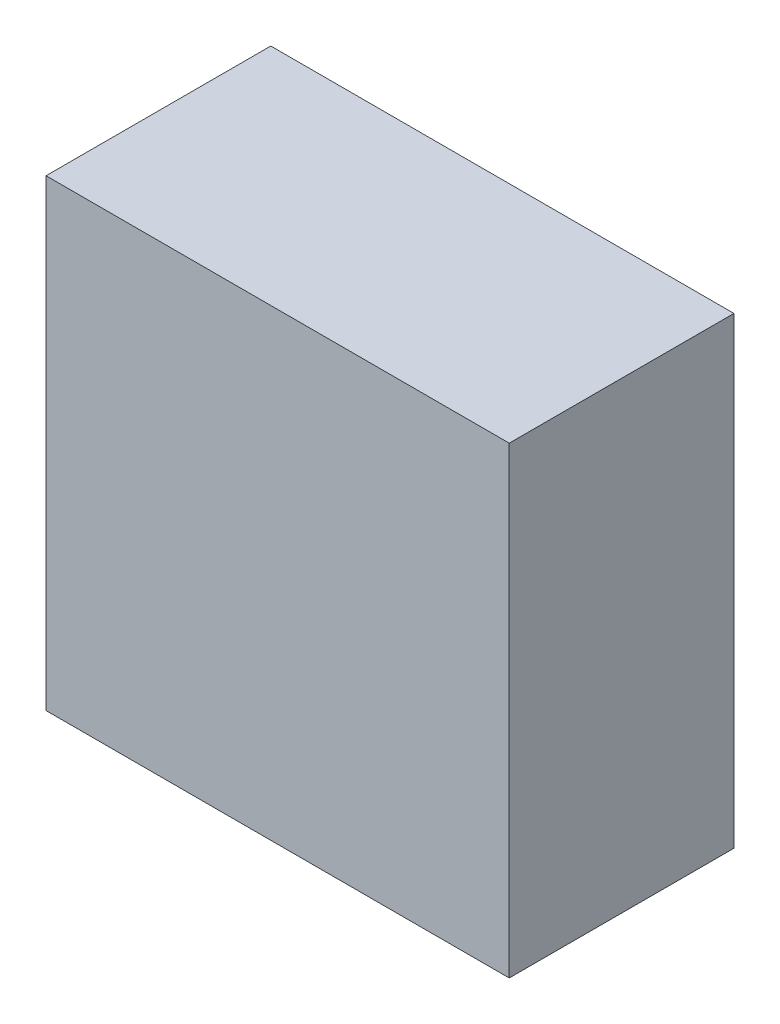
ISO-10303-21;
HEADER;
FILE_DESCRIPTION(('STEP AP214'),'2;1');
FILE_NAME('part.step','',(''),(''),'','','');
FILE_SCHEMA(('AUTOMOTIVE_DESIGN { 1 0 10303 214 1 1 1 1 }'));
ENDSEC;
DATA;
#1=APPLICATION_CONTEXT('core data for automotive mechanical design processes');
#2=APPLICATION_PROTOCOL_DEFINITION('international standard','automotive_design',2000,#1);
#3=PRODUCT_CONTEXT('',#1,'mechanical');
#4=PRODUCT('Part','Part','',(#3));
#5=PRODUCT_RELATED_PRODUCT_CATEGORY('part','',(#4));
#6=PRODUCT_DEFINITION_FORMATION('','',#4);
#7=PRODUCT_DEFINITION_CONTEXT('part definition',#1,'design');
#8=PRODUCT_DEFINITION('design','',#6,#7);
#9=PRODUCT_DEFINITION_SHAPE('','',#8);
#10=(LENGTH_UNIT() NAMED_UNIT(*) SI_UNIT(.MILLI.,.METRE.));
#11=(NAMED_UNIT(*) PLANE_ANGLE_UNIT() SI_UNIT($,.RADIAN.));
#12=(NAMED_UNIT(*) SI_UNIT($,.STERADIAN.) SOLID_ANGLE_UNIT());
#13=UNCERTAINTY_MEASURE_WITH_UNIT(LENGTH_MEASURE(1.E-05),#10,'distance_accuracy_value','');
#14=(GEOMETRIC_REPRESENTATION_CONTEXT(3) GLOBAL_UNCERTAINTY_ASSIGNED_CONTEXT((#13)) GLOBAL_UNIT_ASSIGNED_CONTEXT((#10,
#11,#12)) REPRESENTATION_CONTEXT('',''));
#15=CARTESIAN_POINT('',(0.,0.,0.));
#16=DIRECTION('',(0.,0.,1.));
#17=DIRECTION('',(1.,0.,0.));
#18=AXIS2_PLACEMENT_3D('',#15,#16,#17);
#19=CARTESIAN_POINT('',(0.0508,2.921,2.16));
#20=DIRECTION('',(0.,0.,-1.));
#21=DIRECTION('',(-1.,0.,0.));
#22=AXIS2_PLACEMENT_3D('',#19,#20,#21);
#23=PLANE('',#22);
#24=DIRECTION('',(1.,0.,0.));
#25=VECTOR('',#24,1.);
#26=CARTESIAN_POINT('',(-3.8862,-1.016,2.16));
#27=LINE('',#26,#25);
#28=CARTESIAN_POINT('',(-3.8862,-1.016,2.16));
#29=VERTEX_POINT('',#28);
#30=CARTESIAN_POINT('',(0.0508,-1.016,2.16));
#31=VERTEX_POINT('',#30);
#32=EDGE_CURVE('E67',#29,#31,#27,.T.);
#33=ORIENTED_EDGE('',*,*,#32,.T.);
#34=DIRECTION('',(0.,1.,0.));
#35=VECTOR('',#34,1.);
#36=CARTESIAN_POINT('',(0.0508,-1.016,2.16));
#37=LINE('',#36,#35);
#38=CARTESIAN_POINT('',(0.0508,2.921,2.16));
#39=VERTEX_POINT('',#38);
#40=EDGE_CURVE('E54',#31,#39,#37,.T.);
#41=ORIENTED_EDGE('',*,*,#40,.T.);
#42=DIRECTION('',(1.,0.,0.));
#43=VECTOR('',#42,1.);
#44=CARTESIAN_POINT('',(0.0508,2.921,2.16));
#45=LINE('',#44,#43);
#46=CARTESIAN_POINT('',(-3.8862,2.921,2.16));
#47=VERTEX_POINT('',#46);
#48=EDGE_CURVE('E19',#39,#47,#45,.F.);
#49=ORIENTED_EDGE('',*,*,#48,.T.);
#50=DIRECTION('',(0.,1.,0.));
#51=VECTOR('',#50,1.);
#52=CARTESIAN_POINT('',(-3.8862,2.921,2.16));
#53=LINE('',#52,#51);
#54=EDGE_CURVE('E80',#47,#29,#53,.F.);
#55=ORIENTED_EDGE('',*,*,#54,.T.);
#56=EDGE_LOOP('',(#33,#41,#49,#55));
#57=FACE_BOUND('',#56,.T.);
#58=ADVANCED_FACE('F16',(#57),#23,.F.);
#59=CARTESIAN_POINT('',(0.0508,2.921,0.25));
#60=DIRECTION('',(0.,-1.,0.));
#61=DIRECTION('',(0.,0.,-1.));
#62=AXIS2_PLACEMENT_3D('',#59,#60,#61);
#63=PLANE('',#62);
#64=DIRECTION('',(0.,0.,1.));
#65=VECTOR('',#64,1.);
#66=CARTESIAN_POINT('',(0.0508,2.921,0.25));
#67=LINE('',#66,#65);
#68=CARTESIAN_POINT('',(0.0508,2.921,0.25));
#69=VERTEX_POINT('',#68);
#70=EDGE_CURVE('E60',#39,#69,#67,.F.);
#71=ORIENTED_EDGE('',*,*,#70,.T.);
#72=DIRECTION('',(-1.,0.,0.));
#73=VECTOR('',#72,1.);
#74=CARTESIAN_POINT('',(0.0508,2.921,0.25));
#75=LINE('',#74,#73);
#76=CARTESIAN_POINT('',(-3.8862,2.921,0.25));
#77=VERTEX_POINT('',#76);
#78=EDGE_CURVE('E82',#77,#69,#75,.F.);
#79=ORIENTED_EDGE('',*,*,#78,.F.);
#80=DIRECTION('',(0.,0.,-1.));
#81=VECTOR('',#80,1.);
#82=CARTESIAN_POINT('',(-3.8862,2.921,0.25));
#83=LINE('',#82,#81);
#84=EDGE_CURVE('E63',#77,#47,#83,.F.);
#85=ORIENTED_EDGE('',*,*,#84,.T.);
#86=ORIENTED_EDGE('',*,*,#48,.F.);
#87=EDGE_LOOP('',(#71,#79,#85,#86));
#88=FACE_BOUND('',#87,.T.);
#89=ADVANCED_FACE('F59',(#88),#63,.F.);
#90=CARTESIAN_POINT('',(0.0508,-1.016,0.25));
#91=DIRECTION('',(-1.,0.,0.));
#92=DIRECTION('',(0.,0.,1.));
#93=AXIS2_PLACEMENT_3D('',#90,#91,#92);
#94=PLANE('',#93);
#95=DIRECTION('',(0.,0.,1.));
#96=VECTOR('',#95,1.);
#97=CARTESIAN_POINT('',(0.0508,-1.016,0.25));
#98=LINE('',#97,#96);
#99=CARTESIAN_POINT('',(0.0508,-1.016,0.25));
#100=VERTEX_POINT('',#99);
#101=EDGE_CURVE('E69',#31,#100,#98,.F.);
#102=ORIENTED_EDGE('',*,*,#101,.T.);
#103=DIRECTION('',(0.,1.,0.));
#104=VECTOR('',#103,1.);
#105=CARTESIAN_POINT('',(0.0508,2.921,0.25));
#106=LINE('',#105,#104);
#107=EDGE_CURVE('E73',#69,#100,#106,.F.);
#108=ORIENTED_EDGE('',*,*,#107,.F.);
#109=ORIENTED_EDGE('',*,*,#70,.F.);
#110=ORIENTED_EDGE('',*,*,#40,.F.);
#111=EDGE_LOOP('',(#102,#108,#109,#110));
#112=FACE_BOUND('',#111,.T.);
#113=ADVANCED_FACE('F71',(#112),#94,.F.);
#114=CARTESIAN_POINT('',(-3.8862,-1.016,0.25));
#115=DIRECTION('',(0.,1.,0.));
#116=DIRECTION('',(0.,0.,1.));
#117=AXIS2_PLACEMENT_3D('',#114,#115,#116);
#118=PLANE('',#117);
#119=DIRECTION('',(0.,0.,-1.));
#120=VECTOR('',#119,1.);
#121=CARTESIAN_POINT('',(-3.8862,-1.016,0.25));
#122=LINE('',#121,#120);
#123=CARTESIAN_POINT('',(-3.8862,-1.016,0.25));
#124=VERTEX_POINT('',#123);
#125=EDGE_CURVE('E34',#29,#124,#122,.T.);
#126=ORIENTED_EDGE('',*,*,#125,.T.);
#127=DIRECTION('',(-1.,0.,0.));
#128=VECTOR('',#127,1.);
#129=CARTESIAN_POINT('',(0.0508,-1.016,0.25));
#130=LINE('',#129,#128);
#131=EDGE_CURVE('E25',#100,#124,#130,.T.);
#132=ORIENTED_EDGE('',*,*,#131,.F.);
#133=ORIENTED_EDGE('',*,*,#101,.F.);
#134=ORIENTED_EDGE('',*,*,#32,.F.);
#135=EDGE_LOOP('',(#126,#132,#133,#134));
#136=FACE_BOUND('',#135,.T.);
#137=ADVANCED_FACE('F88',(#136),#118,.F.);
#138=CARTESIAN_POINT('',(-3.8862,2.921,0.25));
#139=DIRECTION('',(1.,0.,0.));
#140=DIRECTION('',(0.,0.,-1.));
#141=AXIS2_PLACEMENT_3D('',#138,#139,#140);
#142=PLANE('',#141);
#143=ORIENTED_EDGE('',*,*,#84,.F.);
#144=DIRECTION('',(0.,1.,0.));
#145=VECTOR('',#144,1.);
#146=CARTESIAN_POINT('',(-3.8862,2.921,0.25));
#147=LINE('',#146,#145);
#148=EDGE_CURVE('E10',#124,#77,#147,.T.);
#149=ORIENTED_EDGE('',*,*,#148,.F.);
#150=ORIENTED_EDGE('',*,*,#125,.F.);
#151=ORIENTED_EDGE('',*,*,#54,.F.);
#152=EDGE_LOOP('',(#143,#149,#150,#151));
#153=FACE_BOUND('',#152,.T.);
#154=ADVANCED_FACE('F90',(#153),#142,.F.);
#155=CARTESIAN_POINT('',(0.0508,2.921,0.25));
#156=DIRECTION('',(0.,0.,-1.));
#157=DIRECTION('',(-1.,0.,0.));
#158=AXIS2_PLACEMENT_3D('',#155,#156,#157);
#159=PLANE('',#158);
#160=ORIENTED_EDGE('',*,*,#131,.T.);
#161=ORIENTED_EDGE('',*,*,#148,.T.);
#162=ORIENTED_EDGE('',*,*,#78,.T.);
#163=ORIENTED_EDGE('',*,*,#107,.T.);
#164=EDGE_LOOP('',(#160,#161,#162,#163));
#165=FACE_BOUND('',#164,.T.);
#166=ADVANCED_FACE('F87',(#165),#159,.T.);
#167=CLOSED_SHELL('',(#58,#89,#113,#137,#154,#166));
#168=MANIFOLD_SOLID_BREP('B1',#167);
#169=ADVANCED_BREP_SHAPE_REPRESENTATION('',(#18,#168),#14);
#170=SHAPE_DEFINITION_REPRESENTATION(#9,#169);
ENDSEC;
END-ISO-10303-21;
